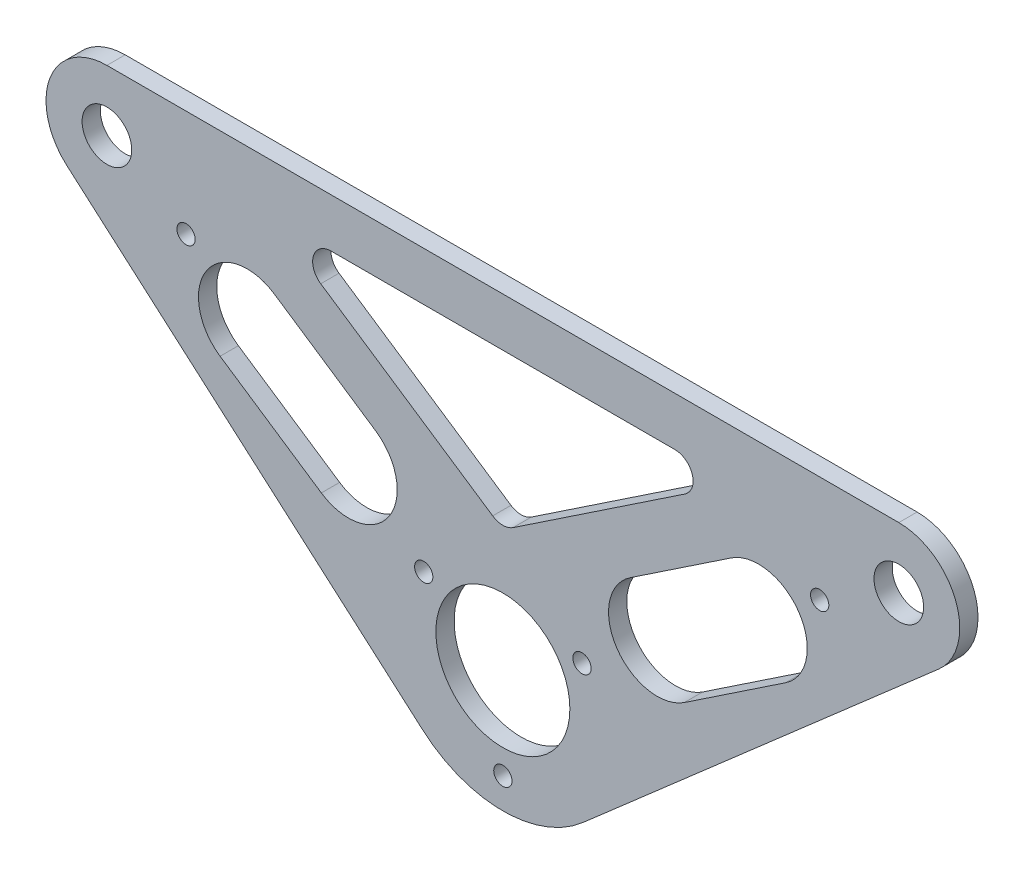
ISO-10303-21;
HEADER;
FILE_DESCRIPTION(('STEP AP214'),'2;1');
FILE_NAME('part.step','',(''),(''),'','','');
FILE_SCHEMA(('AUTOMOTIVE_DESIGN { 1 0 10303 214 1 1 1 1 }'));
ENDSEC;
DATA;
#1=APPLICATION_CONTEXT('core data for automotive mechanical design processes');
#2=APPLICATION_PROTOCOL_DEFINITION('international standard','automotive_design',2000,#1);
#3=PRODUCT_CONTEXT('',#1,'mechanical');
#4=PRODUCT('Part','Part','',(#3));
#5=PRODUCT_RELATED_PRODUCT_CATEGORY('part','',(#4));
#6=PRODUCT_DEFINITION_FORMATION('','',#4);
#7=PRODUCT_DEFINITION_CONTEXT('part definition',#1,'design');
#8=PRODUCT_DEFINITION('design','',#6,#7);
#9=PRODUCT_DEFINITION_SHAPE('','',#8);
#10=(LENGTH_UNIT() NAMED_UNIT(*) SI_UNIT(.MILLI.,.METRE.));
#11=(NAMED_UNIT(*) PLANE_ANGLE_UNIT() SI_UNIT($,.RADIAN.));
#12=(NAMED_UNIT(*) SI_UNIT($,.STERADIAN.) SOLID_ANGLE_UNIT());
#13=UNCERTAINTY_MEASURE_WITH_UNIT(LENGTH_MEASURE(1.E-05),#10,'distance_accuracy_value','');
#14=(GEOMETRIC_REPRESENTATION_CONTEXT(3) GLOBAL_UNCERTAINTY_ASSIGNED_CONTEXT((#13)) GLOBAL_UNIT_ASSIGNED_CONTEXT((#10,
#11,#12)) REPRESENTATION_CONTEXT('',''));
#15=CARTESIAN_POINT('',(0.,0.,0.));
#16=DIRECTION('',(0.,0.,1.));
#17=DIRECTION('',(1.,0.,0.));
#18=AXIS2_PLACEMENT_3D('',#15,#16,#17);
#19=CARTESIAN_POINT('',(65.,43.5,1.5));
#20=DIRECTION('',(0.,0.,-1.));
#21=DIRECTION('',(-1.,0.,0.));
#22=AXIS2_PLACEMENT_3D('',#19,#20,#21);
#23=PLANE('',#22);
#24=CARTESIAN_POINT('',(52.0096189432334,36.,1.5));
#25=DIRECTION('',(0.,0.,-1.));
#26=DIRECTION('',(-1.,0.,0.));
#27=AXIS2_PLACEMENT_3D('',#24,#25,#26);
#28=CIRCLE('',#27,1.49999999999999);
#29=CARTESIAN_POINT('',(50.5096189432334,36.,1.5));
#30=VERTEX_POINT('',#29);
#31=EDGE_CURVE('E722',#30,#30,#28,.T.);
#32=ORIENTED_EDGE('',*,*,#31,.T.);
#33=EDGE_LOOP('',(#32));
#34=FACE_BOUND('',#33,.T.);
#35=CARTESIAN_POINT('',(-52.0096189432334,36.,1.5));
#36=DIRECTION('',(0.,0.,1.));
#37=DIRECTION('',(1.,0.,0.));
#38=AXIS2_PLACEMENT_3D('',#35,#36,#37);
#39=CIRCLE('',#38,1.49999999999999);
#40=CARTESIAN_POINT('',(-50.5096189432334,36.,1.5));
#41=VERTEX_POINT('',#40);
#42=EDGE_CURVE('E704',#41,#41,#39,.T.);
#43=ORIENTED_EDGE('',*,*,#42,.F.);
#44=EDGE_LOOP('',(#43));
#45=FACE_BOUND('',#44,.T.);
#46=CARTESIAN_POINT('',(0.,-15.,1.5));
#47=DIRECTION('',(0.,0.,1.));
#48=DIRECTION('',(1.,0.,0.));
#49=AXIS2_PLACEMENT_3D('',#46,#47,#48);
#50=CIRCLE('',#49,1.5);
#51=CARTESIAN_POINT('',(1.5,-15.,1.5));
#52=VERTEX_POINT('',#51);
#53=EDGE_CURVE('E708',#52,#52,#50,.T.);
#54=ORIENTED_EDGE('',*,*,#53,.F.);
#55=EDGE_LOOP('',(#54));
#56=FACE_BOUND('',#55,.T.);
#57=CARTESIAN_POINT('',(-12.9888810567666,7.50086602540386,1.5));
#58=DIRECTION('',(0.,0.,1.));
#59=DIRECTION('',(1.,0.,0.));
#60=AXIS2_PLACEMENT_3D('',#57,#58,#59);
#61=CIRCLE('',#60,1.5);
#62=CARTESIAN_POINT('',(-11.4888810567666,7.50086602540386,1.5));
#63=VERTEX_POINT('',#62);
#64=EDGE_CURVE('E702',#63,#63,#61,.T.);
#65=ORIENTED_EDGE('',*,*,#64,.F.);
#66=EDGE_LOOP('',(#65));
#67=FACE_BOUND('',#66,.T.);
#68=CARTESIAN_POINT('',(12.9918810567667,7.49913397459611,1.5));
#69=DIRECTION('',(0.,0.,1.));
#70=DIRECTION('',(1.,0.,0.));
#71=AXIS2_PLACEMENT_3D('',#68,#69,#70);
#72=CIRCLE('',#71,1.5);
#73=CARTESIAN_POINT('',(14.4918810567667,7.49913397459611,1.5));
#74=VERTEX_POINT('',#73);
#75=EDGE_CURVE('E698',#74,#74,#72,.T.);
#76=ORIENTED_EDGE('',*,*,#75,.F.);
#77=EDGE_LOOP('',(#76));
#78=FACE_BOUND('',#77,.T.);
#79=CARTESIAN_POINT('',(-41.9688065905346,28.0868167182808,1.5));
#80=DIRECTION('',(0.,0.,1.));
#81=DIRECTION('',(1.,0.,0.));
#82=AXIS2_PLACEMENT_3D('',#79,#80,#81);
#83=CIRCLE('',#82,8.);
#84=CARTESIAN_POINT('',(-37.5194098826881,34.7353405346031,1.5));
#85=VERTEX_POINT('',#84);
#86=CARTESIAN_POINT('',(-46.4182032983811,21.4382929019585,1.5));
#87=VERTEX_POINT('',#86);
#88=EDGE_CURVE('E223',#85,#87,#83,.T.);
#89=ORIENTED_EDGE('',*,*,#88,.F.);
#90=DIRECTION('',(-0.831065477040289,0.556174588480809,0.));
#91=VECTOR('',#90,1.);
#92=CARTESIAN_POINT('',(-37.5194098826881,34.7353405346031,1.5));
#93=LINE('',#92,#91);
#94=CARTESIAN_POINT('',(-20.8981003418823,23.611848764987,1.5));
#95=VERTEX_POINT('',#94);
#96=EDGE_CURVE('E231',#95,#85,#93,.T.);
#97=ORIENTED_EDGE('',*,*,#96,.F.);
#98=CARTESIAN_POINT('',(-25.3474970497288,16.9633249486647,1.5));
#99=DIRECTION('',(0.,0.,1.));
#100=DIRECTION('',(1.,0.,0.));
#101=AXIS2_PLACEMENT_3D('',#98,#99,#100);
#102=CIRCLE('',#101,8.);
#103=CARTESIAN_POINT('',(-29.7968937575753,10.3148011323424,1.5));
#104=VERTEX_POINT('',#103);
#105=EDGE_CURVE('E228',#104,#95,#102,.T.);
#106=ORIENTED_EDGE('',*,*,#105,.F.);
#107=DIRECTION('',(0.831065477040289,-0.556174588480809,0.));
#108=VECTOR('',#107,1.);
#109=CARTESIAN_POINT('',(-46.4182032983811,21.4382929019585,1.5));
#110=LINE('',#109,#108);
#111=EDGE_CURVE('E225',#87,#104,#110,.T.);
#112=ORIENTED_EDGE('',*,*,#111,.F.);
#113=EDGE_LOOP('',(#89,#97,#106,#112));
#114=FACE_BOUND('',#113,.T.);
#115=CARTESIAN_POINT('',(-65.,43.5,1.5));
#116=DIRECTION('',(0.,0.,1.));
#117=DIRECTION('',(1.,0.,0.));
#118=AXIS2_PLACEMENT_3D('',#115,#116,#117);
#119=CIRCLE('',#118,4.075);
#120=CARTESIAN_POINT('',(-60.925,43.5,1.5));
#121=VERTEX_POINT('',#120);
#122=EDGE_CURVE('E277',#121,#121,#119,.T.);
#123=ORIENTED_EDGE('',*,*,#122,.F.);
#124=EDGE_LOOP('',(#123));
#125=FACE_BOUND('',#124,.T.);
#126=CARTESIAN_POINT('',(0.,0.,1.5));
#127=DIRECTION('',(0.,0.,1.));
#128=DIRECTION('',(1.,0.,0.));
#129=AXIS2_PLACEMENT_3D('',#126,#127,#128);
#130=CIRCLE('',#129,11.);
#131=CARTESIAN_POINT('',(11.,0.,1.5));
#132=VERTEX_POINT('',#131);
#133=EDGE_CURVE('E283',#132,#132,#130,.T.);
#134=ORIENTED_EDGE('',*,*,#133,.F.);
#135=EDGE_LOOP('',(#134));
#136=FACE_BOUND('',#135,.T.);
#137=CARTESIAN_POINT('',(65.,43.5,1.5));
#138=DIRECTION('',(0.,0.,1.));
#139=DIRECTION('',(-1.,0.,0.));
#140=AXIS2_PLACEMENT_3D('',#137,#138,#139);
#141=CIRCLE('',#140,10.);
#142=CARTESIAN_POINT('',(71.5786680037926,35.9686570058272,1.5));
#143=VERTEX_POINT('',#142);
#144=CARTESIAN_POINT('',(65.,53.5,1.5));
#145=VERTEX_POINT('',#144);
#146=EDGE_CURVE('E289',#143,#145,#141,.T.);
#147=ORIENTED_EDGE('',*,*,#146,.T.);
#148=DIRECTION('',(-1.,0.,0.));
#149=VECTOR('',#148,1.);
#150=CARTESIAN_POINT('',(-65.,53.5,1.5));
#151=LINE('',#150,#149);
#152=CARTESIAN_POINT('',(-65.,53.5,1.5));
#153=VERTEX_POINT('',#152);
#154=EDGE_CURVE('E292',#145,#153,#151,.T.);
#155=ORIENTED_EDGE('',*,*,#154,.T.);
#156=CARTESIAN_POINT('',(-65.,43.5,1.5));
#157=DIRECTION('',(0.,0.,1.));
#158=DIRECTION('',(1.,0.,0.));
#159=AXIS2_PLACEMENT_3D('',#156,#157,#158);
#160=CIRCLE('',#159,10.);
#161=CARTESIAN_POINT('',(-71.5786680037926,35.9686570058272,1.5));
#162=VERTEX_POINT('',#161);
#163=EDGE_CURVE('E295',#153,#162,#160,.T.);
#164=ORIENTED_EDGE('',*,*,#163,.T.);
#165=DIRECTION('',(0.753134299417281,-0.657866800379257,0.));
#166=VECTOR('',#165,1.);
#167=CARTESIAN_POINT('',(-71.5786680037926,35.9686570058272,1.5));
#168=LINE('',#167,#166);
#169=CARTESIAN_POINT('',(-13.1573360075852,-15.0626859883456,1.5));
#170=VERTEX_POINT('',#169);
#171=EDGE_CURVE('E297',#162,#170,#168,.T.);
#172=ORIENTED_EDGE('',*,*,#171,.T.);
#173=CARTESIAN_POINT('',(0.,0.,1.5));
#174=DIRECTION('',(0.,0.,1.));
#175=DIRECTION('',(1.,0.,0.));
#176=AXIS2_PLACEMENT_3D('',#173,#174,#175);
#177=CIRCLE('',#176,20.);
#178=CARTESIAN_POINT('',(13.1573360075852,-15.0626859883456,1.5));
#179=VERTEX_POINT('',#178);
#180=EDGE_CURVE('E299',#170,#179,#177,.T.);
#181=ORIENTED_EDGE('',*,*,#180,.T.);
#182=DIRECTION('',(0.753134299417281,0.657866800379257,0.));
#183=VECTOR('',#182,1.);
#184=CARTESIAN_POINT('',(71.5786680037926,35.9686570058272,1.5));
#185=LINE('',#184,#183);
#186=EDGE_CURVE('E301',#179,#143,#185,.T.);
#187=ORIENTED_EDGE('',*,*,#186,.T.);
#188=EDGE_LOOP('',(#147,#155,#164,#172,#181,#187));
#189=FACE_BOUND('',#188,.T.);
#190=DIRECTION('',(0.831065477040289,0.556174588480809,0.));
#191=VECTOR('',#190,1.);
#192=CARTESIAN_POINT('',(38.1034482758621,45.5,1.5));
#193=LINE('',#192,#191);
#194=CARTESIAN_POINT('',(1.66852376544242,21.1166274430269,1.5));
#195=VERTEX_POINT('',#194);
#196=CARTESIAN_POINT('',(29.8952237236125,40.0068035688791,1.5));
#197=VERTEX_POINT('',#196);
#198=EDGE_CURVE('E260',#195,#197,#193,.T.);
#199=ORIENTED_EDGE('',*,*,#198,.F.);
#200=CARTESIAN_POINT('',(0.,23.6098238741477,1.5));
#201=DIRECTION('',(0.,0.,-1.));
#202=DIRECTION('',(-1.,0.,0.));
#203=AXIS2_PLACEMENT_3D('',#200,#201,#202);
#204=CIRCLE('',#203,3.);
#205=CARTESIAN_POINT('',(-1.66852376544242,21.1166274430268,1.5));
#206=VERTEX_POINT('',#205);
#207=EDGE_CURVE('E11',#195,#206,#204,.T.);
#208=ORIENTED_EDGE('',*,*,#207,.T.);
#209=DIRECTION('',(0.831065477040289,-0.556174588480809,0.));
#210=VECTOR('',#209,1.);
#211=CARTESIAN_POINT('',(-38.1034482758621,45.5,1.5));
#212=LINE('',#211,#210);
#213=CARTESIAN_POINT('',(-29.8952237236125,40.0068035688791,1.5));
#214=VERTEX_POINT('',#213);
#215=EDGE_CURVE('E266',#214,#206,#212,.T.);
#216=ORIENTED_EDGE('',*,*,#215,.F.);
#217=CARTESIAN_POINT('',(-28.2266999581701,42.5,1.5));
#218=DIRECTION('',(0.,0.,-1.));
#219=DIRECTION('',(-1.,0.,0.));
#220=AXIS2_PLACEMENT_3D('',#217,#218,#219);
#221=CIRCLE('',#220,3.);
#222=CARTESIAN_POINT('',(-28.2266999581701,45.5,1.5));
#223=VERTEX_POINT('',#222);
#224=EDGE_CURVE('E348',#214,#223,#221,.T.);
#225=ORIENTED_EDGE('',*,*,#224,.T.);
#226=DIRECTION('',(-1.,0.,0.));
#227=VECTOR('',#226,1.);
#228=CARTESIAN_POINT('',(-38.1034482758621,45.5,1.5));
#229=LINE('',#228,#227);
#230=CARTESIAN_POINT('',(28.2266999581701,45.5,1.5));
#231=VERTEX_POINT('',#230);
#232=EDGE_CURVE('E262',#231,#223,#229,.T.);
#233=ORIENTED_EDGE('',*,*,#232,.F.);
#234=CARTESIAN_POINT('',(28.2266999581701,42.5,1.5));
#235=DIRECTION('',(0.,0.,-1.));
#236=DIRECTION('',(-1.,0.,0.));
#237=AXIS2_PLACEMENT_3D('',#234,#235,#236);
#238=CIRCLE('',#237,3.);
#239=EDGE_CURVE('E56',#231,#197,#238,.T.);
#240=ORIENTED_EDGE('',*,*,#239,.T.);
#241=EDGE_LOOP('',(#199,#208,#216,#225,#233,#240));
#242=FACE_BOUND('',#241,.T.);
#243=CARTESIAN_POINT('',(65.,43.5,1.5));
#244=DIRECTION('',(0.,0.,1.));
#245=DIRECTION('',(1.,0.,0.));
#246=AXIS2_PLACEMENT_3D('',#243,#244,#245);
#247=CIRCLE('',#246,4.075);
#248=CARTESIAN_POINT('',(69.075,43.5,1.5));
#249=VERTEX_POINT('',#248);
#250=EDGE_CURVE('E254',#249,#249,#247,.T.);
#251=ORIENTED_EDGE('',*,*,#250,.F.);
#252=EDGE_LOOP('',(#251));
#253=FACE_BOUND('',#252,.T.);
#254=CARTESIAN_POINT('',(41.9688065905346,28.0868167182808,1.5));
#255=DIRECTION('',(0.,0.,1.));
#256=DIRECTION('',(-1.,0.,0.));
#257=AXIS2_PLACEMENT_3D('',#254,#255,#256);
#258=CIRCLE('',#257,8.);
#259=CARTESIAN_POINT('',(46.4182032983811,21.4382929019585,1.5));
#260=VERTEX_POINT('',#259);
#261=CARTESIAN_POINT('',(37.5194098826881,34.7353405346031,1.5));
#262=VERTEX_POINT('',#261);
#263=EDGE_CURVE('E180',#260,#262,#258,.T.);
#264=ORIENTED_EDGE('',*,*,#263,.F.);
#265=DIRECTION('',(0.831065477040289,0.556174588480809,0.));
#266=VECTOR('',#265,1.);
#267=CARTESIAN_POINT('',(46.4182032983811,21.4382929019585,1.5));
#268=LINE('',#267,#266);
#269=CARTESIAN_POINT('',(29.7968937575753,10.3148011323423,1.5));
#270=VERTEX_POINT('',#269);
#271=EDGE_CURVE('E205',#270,#260,#268,.T.);
#272=ORIENTED_EDGE('',*,*,#271,.F.);
#273=CARTESIAN_POINT('',(25.3474970497288,16.9633249486647,1.5));
#274=DIRECTION('',(0.,0.,1.));
#275=DIRECTION('',(-1.,0.,0.));
#276=AXIS2_PLACEMENT_3D('',#273,#274,#275);
#277=CIRCLE('',#276,8.);
#278=CARTESIAN_POINT('',(20.8981003418823,23.611848764987,1.5));
#279=VERTEX_POINT('',#278);
#280=EDGE_CURVE('E203',#279,#270,#277,.T.);
#281=ORIENTED_EDGE('',*,*,#280,.F.);
#282=DIRECTION('',(-0.831065477040289,-0.556174588480809,0.));
#283=VECTOR('',#282,1.);
#284=CARTESIAN_POINT('',(37.5194098826881,34.7353405346031,1.5));
#285=LINE('',#284,#283);
#286=EDGE_CURVE('E190',#262,#279,#285,.T.);
#287=ORIENTED_EDGE('',*,*,#286,.F.);
#288=EDGE_LOOP('',(#264,#272,#281,#287));
#289=FACE_BOUND('',#288,.T.);
#290=ADVANCED_FACE('F41',(#34,#45,#56,#67,#78,#114,#125,#136,#189,#242,#253,#289),#23,.F.);
#291=CARTESIAN_POINT('',(65.,43.5,-1.5));
#292=DIRECTION('',(0.,0.,-1.));
#293=DIRECTION('',(-1.,0.,0.));
#294=AXIS2_PLACEMENT_3D('',#291,#292,#293);
#295=PLANE('',#294);
#296=CARTESIAN_POINT('',(52.0096189432334,36.,-1.5));
#297=DIRECTION('',(0.,0.,-1.));
#298=DIRECTION('',(-1.,0.,0.));
#299=AXIS2_PLACEMENT_3D('',#296,#297,#298);
#300=CIRCLE('',#299,1.49999999999999);
#301=CARTESIAN_POINT('',(50.5096189432334,36.,-1.5));
#302=VERTEX_POINT('',#301);
#303=EDGE_CURVE('E719',#302,#302,#300,.T.);
#304=ORIENTED_EDGE('',*,*,#303,.F.);
#305=EDGE_LOOP('',(#304));
#306=FACE_BOUND('',#305,.T.);
#307=CARTESIAN_POINT('',(-52.0096189432334,36.,-1.5));
#308=DIRECTION('',(0.,0.,1.));
#309=DIRECTION('',(1.,0.,0.));
#310=AXIS2_PLACEMENT_3D('',#307,#308,#309);
#311=CIRCLE('',#310,1.49999999999999);
#312=CARTESIAN_POINT('',(-50.5096189432334,36.,-1.5));
#313=VERTEX_POINT('',#312);
#314=EDGE_CURVE('E716',#313,#313,#311,.T.);
#315=ORIENTED_EDGE('',*,*,#314,.T.);
#316=EDGE_LOOP('',(#315));
#317=FACE_BOUND('',#316,.T.);
#318=CARTESIAN_POINT('',(0.,-15.,-1.5));
#319=DIRECTION('',(0.,0.,1.));
#320=DIRECTION('',(1.,0.,0.));
#321=AXIS2_PLACEMENT_3D('',#318,#319,#320);
#322=CIRCLE('',#321,1.5);
#323=CARTESIAN_POINT('',(1.5,-15.,-1.5));
#324=VERTEX_POINT('',#323);
#325=EDGE_CURVE('E212',#324,#324,#322,.T.);
#326=ORIENTED_EDGE('',*,*,#325,.T.);
#327=EDGE_LOOP('',(#326));
#328=FACE_BOUND('',#327,.T.);
#329=CARTESIAN_POINT('',(-12.9888810567666,7.50086602540386,-1.5));
#330=DIRECTION('',(0.,0.,1.));
#331=DIRECTION('',(1.,0.,0.));
#332=AXIS2_PLACEMENT_3D('',#329,#330,#331);
#333=CIRCLE('',#332,1.5);
#334=CARTESIAN_POINT('',(-11.4888810567666,7.50086602540386,-1.5));
#335=VERTEX_POINT('',#334);
#336=EDGE_CURVE('E700',#335,#335,#333,.T.);
#337=ORIENTED_EDGE('',*,*,#336,.T.);
#338=EDGE_LOOP('',(#337));
#339=FACE_BOUND('',#338,.T.);
#340=CARTESIAN_POINT('',(12.9918810567667,7.49913397459611,-1.5));
#341=DIRECTION('',(0.,0.,1.));
#342=DIRECTION('',(1.,0.,0.));
#343=AXIS2_PLACEMENT_3D('',#340,#341,#342);
#344=CIRCLE('',#343,1.5);
#345=CARTESIAN_POINT('',(14.4918810567667,7.49913397459611,-1.5));
#346=VERTEX_POINT('',#345);
#347=EDGE_CURVE('E695',#346,#346,#344,.T.);
#348=ORIENTED_EDGE('',*,*,#347,.T.);
#349=EDGE_LOOP('',(#348));
#350=FACE_BOUND('',#349,.T.);
#351=DIRECTION('',(-1.,0.,0.));
#352=VECTOR('',#351,1.);
#353=CARTESIAN_POINT('',(-38.1034482758621,45.5,-1.5));
#354=LINE('',#353,#352);
#355=CARTESIAN_POINT('',(28.2266999581701,45.5,-1.5));
#356=VERTEX_POINT('',#355);
#357=CARTESIAN_POINT('',(-28.2266999581701,45.5,-1.5));
#358=VERTEX_POINT('',#357);
#359=EDGE_CURVE('E272',#356,#358,#354,.T.);
#360=ORIENTED_EDGE('',*,*,#359,.T.);
#361=CARTESIAN_POINT('',(-28.2266999581701,42.5,-1.5));
#362=DIRECTION('',(0.,0.,-1.));
#363=DIRECTION('',(-1.,0.,0.));
#364=AXIS2_PLACEMENT_3D('',#361,#362,#363);
#365=CIRCLE('',#364,3.);
#366=CARTESIAN_POINT('',(-29.8952237236125,40.0068035688791,-1.5));
#367=VERTEX_POINT('',#366);
#368=EDGE_CURVE('E346',#358,#367,#365,.F.);
#369=ORIENTED_EDGE('',*,*,#368,.T.);
#370=DIRECTION('',(0.831065477040289,-0.556174588480809,0.));
#371=VECTOR('',#370,1.);
#372=CARTESIAN_POINT('',(-38.1034482758621,45.5,-1.5));
#373=LINE('',#372,#371);
#374=CARTESIAN_POINT('',(-1.66852376544242,21.1166274430268,-1.5));
#375=VERTEX_POINT('',#374);
#376=EDGE_CURVE('E263',#367,#375,#373,.T.);
#377=ORIENTED_EDGE('',*,*,#376,.T.);
#378=CARTESIAN_POINT('',(0.,23.6098238741477,-1.5));
#379=DIRECTION('',(0.,0.,-1.));
#380=DIRECTION('',(-1.,0.,0.));
#381=AXIS2_PLACEMENT_3D('',#378,#379,#380);
#382=CIRCLE('',#381,3.);
#383=CARTESIAN_POINT('',(1.66852376544242,21.1166274430269,-1.5));
#384=VERTEX_POINT('',#383);
#385=EDGE_CURVE('E49',#375,#384,#382,.F.);
#386=ORIENTED_EDGE('',*,*,#385,.T.);
#387=DIRECTION('',(0.831065477040289,0.556174588480809,0.));
#388=VECTOR('',#387,1.);
#389=CARTESIAN_POINT('',(38.1034482758621,45.5,-1.5));
#390=LINE('',#389,#388);
#391=CARTESIAN_POINT('',(29.8952237236125,40.0068035688791,-1.5));
#392=VERTEX_POINT('',#391);
#393=EDGE_CURVE('E257',#384,#392,#390,.T.);
#394=ORIENTED_EDGE('',*,*,#393,.T.);
#395=CARTESIAN_POINT('',(28.2266999581701,42.5,-1.5));
#396=DIRECTION('',(0.,0.,-1.));
#397=DIRECTION('',(-1.,0.,0.));
#398=AXIS2_PLACEMENT_3D('',#395,#396,#397);
#399=CIRCLE('',#398,3.);
#400=EDGE_CURVE('E350',#392,#356,#399,.F.);
#401=ORIENTED_EDGE('',*,*,#400,.T.);
#402=EDGE_LOOP('',(#360,#369,#377,#386,#394,#401));
#403=FACE_BOUND('',#402,.T.);
#404=CARTESIAN_POINT('',(-65.,43.5,-1.5));
#405=DIRECTION('',(0.,0.,1.));
#406=DIRECTION('',(1.,0.,0.));
#407=AXIS2_PLACEMENT_3D('',#404,#405,#406);
#408=CIRCLE('',#407,4.075);
#409=CARTESIAN_POINT('',(-60.925,43.5,-1.5));
#410=VERTEX_POINT('',#409);
#411=EDGE_CURVE('E269',#410,#410,#408,.T.);
#412=ORIENTED_EDGE('',*,*,#411,.T.);
#413=EDGE_LOOP('',(#412));
#414=FACE_BOUND('',#413,.T.);
#415=CARTESIAN_POINT('',(65.,43.5,-1.5));
#416=DIRECTION('',(0.,0.,1.));
#417=DIRECTION('',(-1.,0.,0.));
#418=AXIS2_PLACEMENT_3D('',#415,#416,#417);
#419=CIRCLE('',#418,10.);
#420=CARTESIAN_POINT('',(71.5786680037926,35.9686570058272,-1.5));
#421=VERTEX_POINT('',#420);
#422=CARTESIAN_POINT('',(65.,53.5,-1.5));
#423=VERTEX_POINT('',#422);
#424=EDGE_CURVE('E286',#421,#423,#419,.T.);
#425=ORIENTED_EDGE('',*,*,#424,.F.);
#426=DIRECTION('',(0.753134299417281,0.657866800379257,0.));
#427=VECTOR('',#426,1.);
#428=CARTESIAN_POINT('',(71.5786680037926,35.9686570058272,-1.5));
#429=LINE('',#428,#427);
#430=CARTESIAN_POINT('',(13.1573360075852,-15.0626859883456,-1.5));
#431=VERTEX_POINT('',#430);
#432=EDGE_CURVE('E293',#431,#421,#429,.T.);
#433=ORIENTED_EDGE('',*,*,#432,.F.);
#434=CARTESIAN_POINT('',(0.,0.,-1.5));
#435=DIRECTION('',(0.,0.,1.));
#436=DIRECTION('',(1.,0.,0.));
#437=AXIS2_PLACEMENT_3D('',#434,#435,#436);
#438=CIRCLE('',#437,20.);
#439=CARTESIAN_POINT('',(-13.1573360075852,-15.0626859883456,-1.5));
#440=VERTEX_POINT('',#439);
#441=EDGE_CURVE('E312',#440,#431,#438,.T.);
#442=ORIENTED_EDGE('',*,*,#441,.F.);
#443=DIRECTION('',(0.753134299417281,-0.657866800379257,0.));
#444=VECTOR('',#443,1.);
#445=CARTESIAN_POINT('',(-71.5786680037926,35.9686570058272,-1.5));
#446=LINE('',#445,#444);
#447=CARTESIAN_POINT('',(-71.5786680037926,35.9686570058272,-1.5));
#448=VERTEX_POINT('',#447);
#449=EDGE_CURVE('E310',#448,#440,#446,.T.);
#450=ORIENTED_EDGE('',*,*,#449,.F.);
#451=CARTESIAN_POINT('',(-65.,43.5,-1.5));
#452=DIRECTION('',(0.,0.,1.));
#453=DIRECTION('',(1.,0.,0.));
#454=AXIS2_PLACEMENT_3D('',#451,#452,#453);
#455=CIRCLE('',#454,10.);
#456=CARTESIAN_POINT('',(-65.,53.5,-1.5));
#457=VERTEX_POINT('',#456);
#458=EDGE_CURVE('E308',#457,#448,#455,.T.);
#459=ORIENTED_EDGE('',*,*,#458,.F.);
#460=DIRECTION('',(-1.,0.,0.));
#461=VECTOR('',#460,1.);
#462=CARTESIAN_POINT('',(-65.,53.5,-1.5));
#463=LINE('',#462,#461);
#464=EDGE_CURVE('E306',#423,#457,#463,.T.);
#465=ORIENTED_EDGE('',*,*,#464,.F.);
#466=EDGE_LOOP('',(#425,#433,#442,#450,#459,#465));
#467=FACE_BOUND('',#466,.T.);
#468=CARTESIAN_POINT('',(0.,0.,-1.5));
#469=DIRECTION('',(0.,0.,1.));
#470=DIRECTION('',(1.,0.,0.));
#471=AXIS2_PLACEMENT_3D('',#468,#469,#470);
#472=CIRCLE('',#471,11.);
#473=CARTESIAN_POINT('',(11.,0.,-1.5));
#474=VERTEX_POINT('',#473);
#475=EDGE_CURVE('E280',#474,#474,#472,.T.);
#476=ORIENTED_EDGE('',*,*,#475,.T.);
#477=EDGE_LOOP('',(#476));
#478=FACE_BOUND('',#477,.T.);
#479=CARTESIAN_POINT('',(65.,43.5,-1.5));
#480=DIRECTION('',(0.,0.,1.));
#481=DIRECTION('',(1.,0.,0.));
#482=AXIS2_PLACEMENT_3D('',#479,#480,#481);
#483=CIRCLE('',#482,4.075);
#484=CARTESIAN_POINT('',(69.075,43.5,-1.5));
#485=VERTEX_POINT('',#484);
#486=EDGE_CURVE('E253',#485,#485,#483,.T.);
#487=ORIENTED_EDGE('',*,*,#486,.T.);
#488=EDGE_LOOP('',(#487));
#489=FACE_BOUND('',#488,.T.);
#490=DIRECTION('',(-0.831065477040289,0.556174588480809,0.));
#491=VECTOR('',#490,1.);
#492=CARTESIAN_POINT('',(-37.5194098826881,34.7353405346031,-1.5));
#493=LINE('',#492,#491);
#494=CARTESIAN_POINT('',(-20.8981003418823,23.611848764987,-1.5));
#495=VERTEX_POINT('',#494);
#496=CARTESIAN_POINT('',(-37.5194098826881,34.7353405346031,-1.5));
#497=VERTEX_POINT('',#496);
#498=EDGE_CURVE('E226',#495,#497,#493,.T.);
#499=ORIENTED_EDGE('',*,*,#498,.T.);
#500=CARTESIAN_POINT('',(-41.9688065905346,28.0868167182808,-1.5));
#501=DIRECTION('',(0.,0.,1.));
#502=DIRECTION('',(1.,0.,0.));
#503=AXIS2_PLACEMENT_3D('',#500,#501,#502);
#504=CIRCLE('',#503,8.);
#505=CARTESIAN_POINT('',(-46.4182032983811,21.4382929019585,-1.5));
#506=VERTEX_POINT('',#505);
#507=EDGE_CURVE('E198',#497,#506,#504,.T.);
#508=ORIENTED_EDGE('',*,*,#507,.T.);
#509=DIRECTION('',(0.831065477040289,-0.556174588480809,0.));
#510=VECTOR('',#509,1.);
#511=CARTESIAN_POINT('',(-46.4182032983811,21.4382929019585,-1.5));
#512=LINE('',#511,#510);
#513=CARTESIAN_POINT('',(-29.7968937575753,10.3148011323424,-1.5));
#514=VERTEX_POINT('',#513);
#515=EDGE_CURVE('E236',#506,#514,#512,.T.);
#516=ORIENTED_EDGE('',*,*,#515,.T.);
#517=CARTESIAN_POINT('',(-25.3474970497288,16.9633249486647,-1.5));
#518=DIRECTION('',(0.,0.,1.));
#519=DIRECTION('',(1.,0.,0.));
#520=AXIS2_PLACEMENT_3D('',#517,#518,#519);
#521=CIRCLE('',#520,8.);
#522=EDGE_CURVE('E239',#514,#495,#521,.T.);
#523=ORIENTED_EDGE('',*,*,#522,.T.);
#524=EDGE_LOOP('',(#499,#508,#516,#523));
#525=FACE_BOUND('',#524,.T.);
#526=DIRECTION('',(0.831065477040289,0.556174588480809,0.));
#527=VECTOR('',#526,1.);
#528=CARTESIAN_POINT('',(46.4182032983811,21.4382929019585,-1.5));
#529=LINE('',#528,#527);
#530=CARTESIAN_POINT('',(29.7968937575753,10.3148011323424,-1.5));
#531=VERTEX_POINT('',#530);
#532=CARTESIAN_POINT('',(46.4182032983811,21.4382929019585,-1.5));
#533=VERTEX_POINT('',#532);
#534=EDGE_CURVE('E191',#531,#533,#529,.T.);
#535=ORIENTED_EDGE('',*,*,#534,.T.);
#536=CARTESIAN_POINT('',(41.9688065905346,28.0868167182808,-1.5));
#537=DIRECTION('',(0.,0.,1.));
#538=DIRECTION('',(-1.,0.,0.));
#539=AXIS2_PLACEMENT_3D('',#536,#537,#538);
#540=CIRCLE('',#539,8.);
#541=CARTESIAN_POINT('',(37.5194098826881,34.7353405346031,-1.5));
#542=VERTEX_POINT('',#541);
#543=EDGE_CURVE('E210',#533,#542,#540,.T.);
#544=ORIENTED_EDGE('',*,*,#543,.T.);
#545=DIRECTION('',(-0.831065477040289,-0.556174588480809,0.));
#546=VECTOR('',#545,1.);
#547=CARTESIAN_POINT('',(37.5194098826881,34.7353405346031,-1.5));
#548=LINE('',#547,#546);
#549=CARTESIAN_POINT('',(20.8981003418823,23.611848764987,-1.5));
#550=VERTEX_POINT('',#549);
#551=EDGE_CURVE('E197',#542,#550,#548,.T.);
#552=ORIENTED_EDGE('',*,*,#551,.T.);
#553=CARTESIAN_POINT('',(25.3474970497288,16.9633249486647,-1.5));
#554=DIRECTION('',(0.,0.,1.));
#555=DIRECTION('',(-1.,0.,0.));
#556=AXIS2_PLACEMENT_3D('',#553,#554,#555);
#557=CIRCLE('',#556,8.);
#558=EDGE_CURVE('E214',#550,#531,#557,.T.);
#559=ORIENTED_EDGE('',*,*,#558,.T.);
#560=EDGE_LOOP('',(#535,#544,#552,#559));
#561=FACE_BOUND('',#560,.T.);
#562=ADVANCED_FACE('F353',(#306,#317,#328,#339,#350,#403,#414,#467,#478,#489,#525,#561),#295,.T.);
#563=CARTESIAN_POINT('',(65.,43.5,1.5));
#564=DIRECTION('',(0.,0.,-1.));
#565=DIRECTION('',(-1.,0.,0.));
#566=AXIS2_PLACEMENT_3D('',#563,#564,#565);
#567=CYLINDRICAL_SURFACE('',#566,10.);
#568=ORIENTED_EDGE('',*,*,#424,.T.);
#569=DIRECTION('',(0.,0.,-1.));
#570=VECTOR('',#569,1.);
#571=CARTESIAN_POINT('',(65.,53.5,1.5));
#572=LINE('',#571,#570);
#573=EDGE_CURVE('E329',#145,#423,#572,.T.);
#574=ORIENTED_EDGE('',*,*,#573,.F.);
#575=ORIENTED_EDGE('',*,*,#146,.F.);
#576=DIRECTION('',(0.,0.,-1.));
#577=VECTOR('',#576,1.);
#578=CARTESIAN_POINT('',(71.5786680037926,35.9686570058272,1.5));
#579=LINE('',#578,#577);
#580=EDGE_CURVE('E303',#143,#421,#579,.T.);
#581=ORIENTED_EDGE('',*,*,#580,.T.);
#582=EDGE_LOOP('',(#568,#574,#575,#581));
#583=FACE_BOUND('',#582,.T.);
#584=ADVANCED_FACE('F390',(#583),#567,.T.);
#585=CARTESIAN_POINT('',(-65.,53.5,1.5));
#586=DIRECTION('',(0.,-1.,0.));
#587=DIRECTION('',(0.,0.,-1.));
#588=AXIS2_PLACEMENT_3D('',#585,#586,#587);
#589=PLANE('',#588);
#590=ORIENTED_EDGE('',*,*,#464,.T.);
#591=DIRECTION('',(0.,0.,-1.));
#592=VECTOR('',#591,1.);
#593=CARTESIAN_POINT('',(-65.,53.5,1.5));
#594=LINE('',#593,#592);
#595=EDGE_CURVE('E326',#153,#457,#594,.T.);
#596=ORIENTED_EDGE('',*,*,#595,.F.);
#597=ORIENTED_EDGE('',*,*,#154,.F.);
#598=ORIENTED_EDGE('',*,*,#573,.T.);
#599=EDGE_LOOP('',(#590,#596,#597,#598));
#600=FACE_BOUND('',#599,.T.);
#601=ADVANCED_FACE('F414',(#600),#589,.F.);
#602=CARTESIAN_POINT('',(-65.,43.5,1.5));
#603=DIRECTION('',(0.,0.,-1.));
#604=DIRECTION('',(-1.,0.,0.));
#605=AXIS2_PLACEMENT_3D('',#602,#603,#604);
#606=CYLINDRICAL_SURFACE('',#605,10.);
#607=ORIENTED_EDGE('',*,*,#458,.T.);
#608=DIRECTION('',(0.,0.,-1.));
#609=VECTOR('',#608,1.);
#610=CARTESIAN_POINT('',(-71.5786680037926,35.9686570058272,1.5));
#611=LINE('',#610,#609);
#612=EDGE_CURVE('E323',#162,#448,#611,.T.);
#613=ORIENTED_EDGE('',*,*,#612,.F.);
#614=ORIENTED_EDGE('',*,*,#163,.F.);
#615=ORIENTED_EDGE('',*,*,#595,.T.);
#616=EDGE_LOOP('',(#607,#613,#614,#615));
#617=FACE_BOUND('',#616,.T.);
#618=ADVANCED_FACE('F410',(#617),#606,.T.);
#619=CARTESIAN_POINT('',(-71.5786680037926,35.9686570058272,1.5));
#620=DIRECTION('',(0.657866800379257,0.753134299417281,0.));
#621=DIRECTION('',(-0.753134299417281,0.657866800379257,0.));
#622=AXIS2_PLACEMENT_3D('',#619,#620,#621);
#623=PLANE('',#622);
#624=ORIENTED_EDGE('',*,*,#449,.T.);
#625=DIRECTION('',(0.,0.,-1.));
#626=VECTOR('',#625,1.);
#627=CARTESIAN_POINT('',(-13.1573360075852,-15.0626859883456,1.5));
#628=LINE('',#627,#626);
#629=EDGE_CURVE('E320',#170,#440,#628,.T.);
#630=ORIENTED_EDGE('',*,*,#629,.F.);
#631=ORIENTED_EDGE('',*,*,#171,.F.);
#632=ORIENTED_EDGE('',*,*,#612,.T.);
#633=EDGE_LOOP('',(#624,#630,#631,#632));
#634=FACE_BOUND('',#633,.T.);
#635=ADVANCED_FACE('F406',(#634),#623,.F.);
#636=CARTESIAN_POINT('',(0.,0.,1.5));
#637=DIRECTION('',(0.,0.,-1.));
#638=DIRECTION('',(-1.,0.,0.));
#639=AXIS2_PLACEMENT_3D('',#636,#637,#638);
#640=CYLINDRICAL_SURFACE('',#639,20.);
#641=ORIENTED_EDGE('',*,*,#441,.T.);
#642=DIRECTION('',(0.,0.,-1.));
#643=VECTOR('',#642,1.);
#644=CARTESIAN_POINT('',(13.1573360075852,-15.0626859883456,1.5));
#645=LINE('',#644,#643);
#646=EDGE_CURVE('E317',#179,#431,#645,.T.);
#647=ORIENTED_EDGE('',*,*,#646,.F.);
#648=ORIENTED_EDGE('',*,*,#180,.F.);
#649=ORIENTED_EDGE('',*,*,#629,.T.);
#650=EDGE_LOOP('',(#641,#647,#648,#649));
#651=FACE_BOUND('',#650,.T.);
#652=ADVANCED_FACE('F402',(#651),#640,.T.);
#653=CARTESIAN_POINT('',(71.5786680037926,35.9686570058272,1.5));
#654=DIRECTION('',(-0.657866800379257,0.753134299417281,0.));
#655=DIRECTION('',(-0.753134299417281,-0.657866800379257,0.));
#656=AXIS2_PLACEMENT_3D('',#653,#654,#655);
#657=PLANE('',#656);
#658=ORIENTED_EDGE('',*,*,#432,.T.);
#659=ORIENTED_EDGE('',*,*,#580,.F.);
#660=ORIENTED_EDGE('',*,*,#186,.F.);
#661=ORIENTED_EDGE('',*,*,#646,.T.);
#662=EDGE_LOOP('',(#658,#659,#660,#661));
#663=FACE_BOUND('',#662,.T.);
#664=ADVANCED_FACE('F399',(#663),#657,.F.);
#665=CARTESIAN_POINT('',(0.,0.,1.5));
#666=DIRECTION('',(0.,0.,-1.));
#667=DIRECTION('',(-1.,0.,0.));
#668=AXIS2_PLACEMENT_3D('',#665,#666,#667);
#669=CYLINDRICAL_SURFACE('',#668,11.);
#670=ORIENTED_EDGE('',*,*,#133,.T.);
#671=EDGE_LOOP('',(#670));
#672=FACE_BOUND('',#671,.T.);
#673=ORIENTED_EDGE('',*,*,#475,.F.);
#674=EDGE_LOOP('',(#673));
#675=FACE_BOUND('',#674,.T.);
#676=ADVANCED_FACE('F396',(#672,#675),#669,.F.);
#677=CARTESIAN_POINT('',(-65.,43.5,1.5));
#678=DIRECTION('',(0.,0.,-1.));
#679=DIRECTION('',(-1.,0.,0.));
#680=AXIS2_PLACEMENT_3D('',#677,#678,#679);
#681=CYLINDRICAL_SURFACE('',#680,4.075);
#682=ORIENTED_EDGE('',*,*,#122,.T.);
#683=EDGE_LOOP('',(#682));
#684=FACE_BOUND('',#683,.T.);
#685=ORIENTED_EDGE('',*,*,#411,.F.);
#686=EDGE_LOOP('',(#685));
#687=FACE_BOUND('',#686,.T.);
#688=ADVANCED_FACE('F492',(#684,#687),#681,.F.);
#689=CARTESIAN_POINT('',(38.1034482758621,45.5,1.5));
#690=DIRECTION('',(-0.556174588480809,0.831065477040289,0.));
#691=DIRECTION('',(-0.831065477040289,-0.556174588480809,0.));
#692=AXIS2_PLACEMENT_3D('',#689,#690,#691);
#693=PLANE('',#692);
#694=ORIENTED_EDGE('',*,*,#198,.T.);
#695=DIRECTION('',(0.,0.,-1.));
#696=VECTOR('',#695,1.);
#697=CARTESIAN_POINT('',(29.8952237236125,40.0068035688791,-1.5));
#698=LINE('',#697,#696);
#699=EDGE_CURVE('E343',#197,#392,#698,.T.);
#700=ORIENTED_EDGE('',*,*,#699,.T.);
#701=ORIENTED_EDGE('',*,*,#393,.F.);
#702=DIRECTION('',(0.,0.,-1.));
#703=VECTOR('',#702,1.);
#704=CARTESIAN_POINT('',(1.66852376544243,21.1166274430269,1.5));
#705=LINE('',#704,#703);
#706=EDGE_CURVE('E63',#384,#195,#705,.F.);
#707=ORIENTED_EDGE('',*,*,#706,.T.);
#708=EDGE_LOOP('',(#694,#700,#701,#707));
#709=FACE_BOUND('',#708,.T.);
#710=ADVANCED_FACE('F358',(#709),#693,.T.);
#711=CARTESIAN_POINT('',(-38.1034482758621,45.5,1.5));
#712=DIRECTION('',(0.,-1.,0.));
#713=DIRECTION('',(0.,0.,-1.));
#714=AXIS2_PLACEMENT_3D('',#711,#712,#713);
#715=PLANE('',#714);
#716=ORIENTED_EDGE('',*,*,#232,.T.);
#717=DIRECTION('',(0.,0.,-1.));
#718=VECTOR('',#717,1.);
#719=CARTESIAN_POINT('',(-28.2266999581701,45.5,-1.5));
#720=LINE('',#719,#718);
#721=EDGE_CURVE('E334',#223,#358,#720,.T.);
#722=ORIENTED_EDGE('',*,*,#721,.T.);
#723=ORIENTED_EDGE('',*,*,#359,.F.);
#724=DIRECTION('',(0.,0.,-1.));
#725=VECTOR('',#724,1.);
#726=CARTESIAN_POINT('',(28.2266999581701,45.5,1.5));
#727=LINE('',#726,#725);
#728=EDGE_CURVE('E332',#356,#231,#727,.F.);
#729=ORIENTED_EDGE('',*,*,#728,.T.);
#730=EDGE_LOOP('',(#716,#722,#723,#729));
#731=FACE_BOUND('',#730,.T.);
#732=ADVANCED_FACE('F371',(#731),#715,.T.);
#733=CARTESIAN_POINT('',(-38.1034482758621,45.5,1.5));
#734=DIRECTION('',(0.556174588480809,0.831065477040289,0.));
#735=DIRECTION('',(-0.831065477040289,0.556174588480809,0.));
#736=AXIS2_PLACEMENT_3D('',#733,#734,#735);
#737=PLANE('',#736);
#738=ORIENTED_EDGE('',*,*,#376,.F.);
#739=DIRECTION('',(0.,0.,-1.));
#740=VECTOR('',#739,1.);
#741=CARTESIAN_POINT('',(-29.8952237236125,40.0068035688791,1.5));
#742=LINE('',#741,#740);
#743=EDGE_CURVE('E340',#367,#214,#742,.F.);
#744=ORIENTED_EDGE('',*,*,#743,.T.);
#745=ORIENTED_EDGE('',*,*,#215,.T.);
#746=DIRECTION('',(0.,0.,-1.));
#747=VECTOR('',#746,1.);
#748=CARTESIAN_POINT('',(-1.66852376544242,21.1166274430268,-1.5));
#749=LINE('',#748,#747);
#750=EDGE_CURVE('E337',#206,#375,#749,.T.);
#751=ORIENTED_EDGE('',*,*,#750,.T.);
#752=EDGE_LOOP('',(#738,#744,#745,#751));
#753=FACE_BOUND('',#752,.T.);
#754=ADVANCED_FACE('F365',(#753),#737,.T.);
#755=CARTESIAN_POINT('',(65.,43.5,1.5));
#756=DIRECTION('',(0.,0.,-1.));
#757=DIRECTION('',(-1.,0.,0.));
#758=AXIS2_PLACEMENT_3D('',#755,#756,#757);
#759=CYLINDRICAL_SURFACE('',#758,4.075);
#760=ORIENTED_EDGE('',*,*,#250,.T.);
#761=EDGE_LOOP('',(#760));
#762=FACE_BOUND('',#761,.T.);
#763=ORIENTED_EDGE('',*,*,#486,.F.);
#764=EDGE_LOOP('',(#763));
#765=FACE_BOUND('',#764,.T.);
#766=ADVANCED_FACE('F482',(#762,#765),#759,.F.);
#767=CARTESIAN_POINT('',(-41.9688065905346,28.0868167182808,1.5));
#768=DIRECTION('',(0.,0.,-1.));
#769=DIRECTION('',(-1.,0.,0.));
#770=AXIS2_PLACEMENT_3D('',#767,#768,#769);
#771=CYLINDRICAL_SURFACE('',#770,8.);
#772=ORIENTED_EDGE('',*,*,#507,.F.);
#773=DIRECTION('',(0.,0.,-1.));
#774=VECTOR('',#773,1.);
#775=CARTESIAN_POINT('',(-37.5194098826881,34.7353405346031,1.5));
#776=LINE('',#775,#774);
#777=EDGE_CURVE('E233',#85,#497,#776,.T.);
#778=ORIENTED_EDGE('',*,*,#777,.F.);
#779=ORIENTED_EDGE('',*,*,#88,.T.);
#780=DIRECTION('',(0.,0.,-1.));
#781=VECTOR('',#780,1.);
#782=CARTESIAN_POINT('',(-46.4182032983811,21.4382929019585,1.5));
#783=LINE('',#782,#781);
#784=EDGE_CURVE('E250',#87,#506,#783,.T.);
#785=ORIENTED_EDGE('',*,*,#784,.T.);
#786=EDGE_LOOP('',(#772,#778,#779,#785));
#787=FACE_BOUND('',#786,.T.);
#788=ADVANCED_FACE('F478',(#787),#771,.F.);
#789=CARTESIAN_POINT('',(-46.4182032983811,21.4382929019585,1.5));
#790=DIRECTION('',(0.556174588480809,0.831065477040289,0.));
#791=DIRECTION('',(-0.831065477040289,0.556174588480809,0.));
#792=AXIS2_PLACEMENT_3D('',#789,#790,#791);
#793=PLANE('',#792);
#794=ORIENTED_EDGE('',*,*,#515,.F.);
#795=ORIENTED_EDGE('',*,*,#784,.F.);
#796=ORIENTED_EDGE('',*,*,#111,.T.);
#797=DIRECTION('',(0.,0.,-1.));
#798=VECTOR('',#797,1.);
#799=CARTESIAN_POINT('',(-29.7968937575753,10.3148011323424,1.5));
#800=LINE('',#799,#798);
#801=EDGE_CURVE('E248',#104,#514,#800,.T.);
#802=ORIENTED_EDGE('',*,*,#801,.T.);
#803=EDGE_LOOP('',(#794,#795,#796,#802));
#804=FACE_BOUND('',#803,.T.);
#805=ADVANCED_FACE('F474',(#804),#793,.T.);
#806=CARTESIAN_POINT('',(-25.3474970497288,16.9633249486647,1.5));
#807=DIRECTION('',(0.,0.,-1.));
#808=DIRECTION('',(-1.,0.,0.));
#809=AXIS2_PLACEMENT_3D('',#806,#807,#808);
#810=CYLINDRICAL_SURFACE('',#809,8.);
#811=ORIENTED_EDGE('',*,*,#522,.F.);
#812=ORIENTED_EDGE('',*,*,#801,.F.);
#813=ORIENTED_EDGE('',*,*,#105,.T.);
#814=DIRECTION('',(0.,0.,-1.));
#815=VECTOR('',#814,1.);
#816=CARTESIAN_POINT('',(-20.8981003418823,23.611848764987,1.5));
#817=LINE('',#816,#815);
#818=EDGE_CURVE('E246',#95,#495,#817,.T.);
#819=ORIENTED_EDGE('',*,*,#818,.T.);
#820=EDGE_LOOP('',(#811,#812,#813,#819));
#821=FACE_BOUND('',#820,.T.);
#822=ADVANCED_FACE('F470',(#821),#810,.F.);
#823=CARTESIAN_POINT('',(-37.5194098826881,34.7353405346031,1.5));
#824=DIRECTION('',(-0.556174588480809,-0.831065477040289,0.));
#825=DIRECTION('',(0.831065477040289,-0.556174588480809,0.));
#826=AXIS2_PLACEMENT_3D('',#823,#824,#825);
#827=PLANE('',#826);
#828=ORIENTED_EDGE('',*,*,#498,.F.);
#829=ORIENTED_EDGE('',*,*,#818,.F.);
#830=ORIENTED_EDGE('',*,*,#96,.T.);
#831=ORIENTED_EDGE('',*,*,#777,.T.);
#832=EDGE_LOOP('',(#828,#829,#830,#831));
#833=FACE_BOUND('',#832,.T.);
#834=ADVANCED_FACE('F467',(#833),#827,.T.);
#835=CARTESIAN_POINT('',(41.9688065905346,28.0868167182808,1.5));
#836=DIRECTION('',(0.,0.,-1.));
#837=DIRECTION('',(-1.,0.,0.));
#838=AXIS2_PLACEMENT_3D('',#835,#836,#837);
#839=CYLINDRICAL_SURFACE('',#838,8.);
#840=ORIENTED_EDGE('',*,*,#543,.F.);
#841=DIRECTION('',(0.,0.,-1.));
#842=VECTOR('',#841,1.);
#843=CARTESIAN_POINT('',(46.4182032983811,21.4382929019585,1.5));
#844=LINE('',#843,#842);
#845=EDGE_CURVE('E186',#260,#533,#844,.T.);
#846=ORIENTED_EDGE('',*,*,#845,.F.);
#847=ORIENTED_EDGE('',*,*,#263,.T.);
#848=DIRECTION('',(0.,0.,-1.));
#849=VECTOR('',#848,1.);
#850=CARTESIAN_POINT('',(37.5194098826881,34.7353405346031,1.5));
#851=LINE('',#850,#849);
#852=EDGE_CURVE('E183',#262,#542,#851,.T.);
#853=ORIENTED_EDGE('',*,*,#852,.T.);
#854=EDGE_LOOP('',(#840,#846,#847,#853));
#855=FACE_BOUND('',#854,.T.);
#856=ADVANCED_FACE('F182',(#855),#839,.F.);
#857=CARTESIAN_POINT('',(37.5194098826881,34.7353405346031,1.5));
#858=DIRECTION('',(0.556174588480809,-0.831065477040289,0.));
#859=DIRECTION('',(0.831065477040289,0.556174588480809,0.));
#860=AXIS2_PLACEMENT_3D('',#857,#858,#859);
#861=PLANE('',#860);
#862=ORIENTED_EDGE('',*,*,#551,.F.);
#863=ORIENTED_EDGE('',*,*,#852,.F.);
#864=ORIENTED_EDGE('',*,*,#286,.T.);
#865=DIRECTION('',(0.,0.,-1.));
#866=VECTOR('',#865,1.);
#867=CARTESIAN_POINT('',(20.8981003418823,23.611848764987,1.5));
#868=LINE('',#867,#866);
#869=EDGE_CURVE('E199',#279,#550,#868,.T.);
#870=ORIENTED_EDGE('',*,*,#869,.T.);
#871=EDGE_LOOP('',(#862,#863,#864,#870));
#872=FACE_BOUND('',#871,.T.);
#873=ADVANCED_FACE('F194',(#872),#861,.T.);
#874=CARTESIAN_POINT('',(25.3474970497288,16.9633249486647,1.5));
#875=DIRECTION('',(0.,0.,-1.));
#876=DIRECTION('',(-1.,0.,0.));
#877=AXIS2_PLACEMENT_3D('',#874,#875,#876);
#878=CYLINDRICAL_SURFACE('',#877,8.);
#879=ORIENTED_EDGE('',*,*,#558,.F.);
#880=ORIENTED_EDGE('',*,*,#869,.F.);
#881=ORIENTED_EDGE('',*,*,#280,.T.);
#882=DIRECTION('',(0.,0.,-1.));
#883=VECTOR('',#882,1.);
#884=CARTESIAN_POINT('',(29.7968937575753,10.3148011323424,1.5));
#885=LINE('',#884,#883);
#886=EDGE_CURVE('E220',#270,#531,#885,.T.);
#887=ORIENTED_EDGE('',*,*,#886,.T.);
#888=EDGE_LOOP('',(#879,#880,#881,#887));
#889=FACE_BOUND('',#888,.T.);
#890=ADVANCED_FACE('F453',(#889),#878,.F.);
#891=CARTESIAN_POINT('',(46.4182032983811,21.4382929019585,1.5));
#892=DIRECTION('',(-0.556174588480809,0.831065477040289,0.));
#893=DIRECTION('',(-0.831065477040289,-0.556174588480809,0.));
#894=AXIS2_PLACEMENT_3D('',#891,#892,#893);
#895=PLANE('',#894);
#896=ORIENTED_EDGE('',*,*,#534,.F.);
#897=ORIENTED_EDGE('',*,*,#886,.F.);
#898=ORIENTED_EDGE('',*,*,#271,.T.);
#899=ORIENTED_EDGE('',*,*,#845,.T.);
#900=EDGE_LOOP('',(#896,#897,#898,#899));
#901=FACE_BOUND('',#900,.T.);
#902=ADVANCED_FACE('F451',(#901),#895,.T.);
#903=CARTESIAN_POINT('',(12.9918810567667,7.49913397459611,-1.5));
#904=DIRECTION('',(0.,0.,1.));
#905=DIRECTION('',(1.,0.,0.));
#906=AXIS2_PLACEMENT_3D('',#903,#904,#905);
#907=CYLINDRICAL_SURFACE('',#906,1.5);
#908=ORIENTED_EDGE('',*,*,#347,.F.);
#909=EDGE_LOOP('',(#908));
#910=FACE_BOUND('',#909,.T.);
#911=ORIENTED_EDGE('',*,*,#75,.T.);
#912=EDGE_LOOP('',(#911));
#913=FACE_BOUND('',#912,.T.);
#914=ADVANCED_FACE('F460',(#910,#913),#907,.F.);
#915=CARTESIAN_POINT('',(-12.9888810567666,7.50086602540386,-1.5));
#916=DIRECTION('',(0.,0.,1.));
#917=DIRECTION('',(1.,0.,0.));
#918=AXIS2_PLACEMENT_3D('',#915,#916,#917);
#919=CYLINDRICAL_SURFACE('',#918,1.5);
#920=ORIENTED_EDGE('',*,*,#336,.F.);
#921=EDGE_LOOP('',(#920));
#922=FACE_BOUND('',#921,.T.);
#923=ORIENTED_EDGE('',*,*,#64,.T.);
#924=EDGE_LOOP('',(#923));
#925=FACE_BOUND('',#924,.T.);
#926=ADVANCED_FACE('F608',(#922,#925),#919,.F.);
#927=CARTESIAN_POINT('',(0.,-15.,-1.5));
#928=DIRECTION('',(0.,0.,1.));
#929=DIRECTION('',(1.,0.,0.));
#930=AXIS2_PLACEMENT_3D('',#927,#928,#929);
#931=CYLINDRICAL_SURFACE('',#930,1.5);
#932=ORIENTED_EDGE('',*,*,#325,.F.);
#933=EDGE_LOOP('',(#932));
#934=FACE_BOUND('',#933,.T.);
#935=ORIENTED_EDGE('',*,*,#53,.T.);
#936=EDGE_LOOP('',(#935));
#937=FACE_BOUND('',#936,.T.);
#938=ADVANCED_FACE('F598',(#934,#937),#931,.F.);
#939=CARTESIAN_POINT('',(-52.0096189432334,36.,-1.5));
#940=DIRECTION('',(0.,0.,1.));
#941=DIRECTION('',(1.,0.,0.));
#942=AXIS2_PLACEMENT_3D('',#939,#940,#941);
#943=CYLINDRICAL_SURFACE('',#942,1.49999999999999);
#944=ORIENTED_EDGE('',*,*,#314,.F.);
#945=EDGE_LOOP('',(#944));
#946=FACE_BOUND('',#945,.T.);
#947=ORIENTED_EDGE('',*,*,#42,.T.);
#948=EDGE_LOOP('',(#947));
#949=FACE_BOUND('',#948,.T.);
#950=ADVANCED_FACE('F588',(#946,#949),#943,.F.);
#951=CARTESIAN_POINT('',(52.0096189432334,36.,-1.5));
#952=DIRECTION('',(0.,0.,1.));
#953=DIRECTION('',(1.,0.,0.));
#954=AXIS2_PLACEMENT_3D('',#951,#952,#953);
#955=CYLINDRICAL_SURFACE('',#954,1.49999999999999);
#956=ORIENTED_EDGE('',*,*,#303,.T.);
#957=EDGE_LOOP('',(#956));
#958=FACE_BOUND('',#957,.T.);
#959=ORIENTED_EDGE('',*,*,#31,.F.);
#960=EDGE_LOOP('',(#959));
#961=FACE_BOUND('',#960,.T.);
#962=ADVANCED_FACE('F381',(#958,#961),#955,.F.);
#963=CARTESIAN_POINT('',(-28.2266999581701,42.5,1.5));
#964=DIRECTION('',(0.,0.,1.));
#965=DIRECTION('',(1.,0.,0.));
#966=AXIS2_PLACEMENT_3D('',#963,#964,#965);
#967=CYLINDRICAL_SURFACE('',#966,3.);
#968=ORIENTED_EDGE('',*,*,#224,.F.);
#969=ORIENTED_EDGE('',*,*,#743,.F.);
#970=ORIENTED_EDGE('',*,*,#368,.F.);
#971=ORIENTED_EDGE('',*,*,#721,.F.);
#972=EDGE_LOOP('',(#968,#969,#970,#971));
#973=FACE_BOUND('',#972,.T.);
#974=ADVANCED_FACE('F368',(#973),#967,.F.);
#975=CARTESIAN_POINT('',(28.2266999581701,42.5,1.5));
#976=DIRECTION('',(0.,0.,1.));
#977=DIRECTION('',(1.,0.,0.));
#978=AXIS2_PLACEMENT_3D('',#975,#976,#977);
#979=CYLINDRICAL_SURFACE('',#978,3.);
#980=ORIENTED_EDGE('',*,*,#239,.F.);
#981=ORIENTED_EDGE('',*,*,#728,.F.);
#982=ORIENTED_EDGE('',*,*,#400,.F.);
#983=ORIENTED_EDGE('',*,*,#699,.F.);
#984=EDGE_LOOP('',(#980,#981,#982,#983));
#985=FACE_BOUND('',#984,.T.);
#986=ADVANCED_FACE('F375',(#985),#979,.F.);
#987=CARTESIAN_POINT('',(0.,23.6098238741477,1.5));
#988=DIRECTION('',(0.,0.,1.));
#989=DIRECTION('',(1.,0.,0.));
#990=AXIS2_PLACEMENT_3D('',#987,#988,#989);
#991=CYLINDRICAL_SURFACE('',#990,3.);
#992=ORIENTED_EDGE('',*,*,#207,.F.);
#993=ORIENTED_EDGE('',*,*,#706,.F.);
#994=ORIENTED_EDGE('',*,*,#385,.F.);
#995=ORIENTED_EDGE('',*,*,#750,.F.);
#996=EDGE_LOOP('',(#992,#993,#994,#995));
#997=FACE_BOUND('',#996,.T.);
#998=ADVANCED_FACE('F43',(#997),#991,.F.);
#999=CLOSED_SHELL('',(#290,#562,#584,#601,#618,#635,#652,#664,#676,#688,#710,#732,#754,#766,
#788,#805,#822,#834,#856,#873,#890,#902,#914,#926,#938,#950,#962,#974,#986,#998));
#1000=MANIFOLD_SOLID_BREP('B2',#999);
#1001=ADVANCED_BREP_SHAPE_REPRESENTATION('',(#18,#1000),#14);
#1002=SHAPE_DEFINITION_REPRESENTATION(#9,#1001);
ENDSEC;
END-ISO-10303-21;
